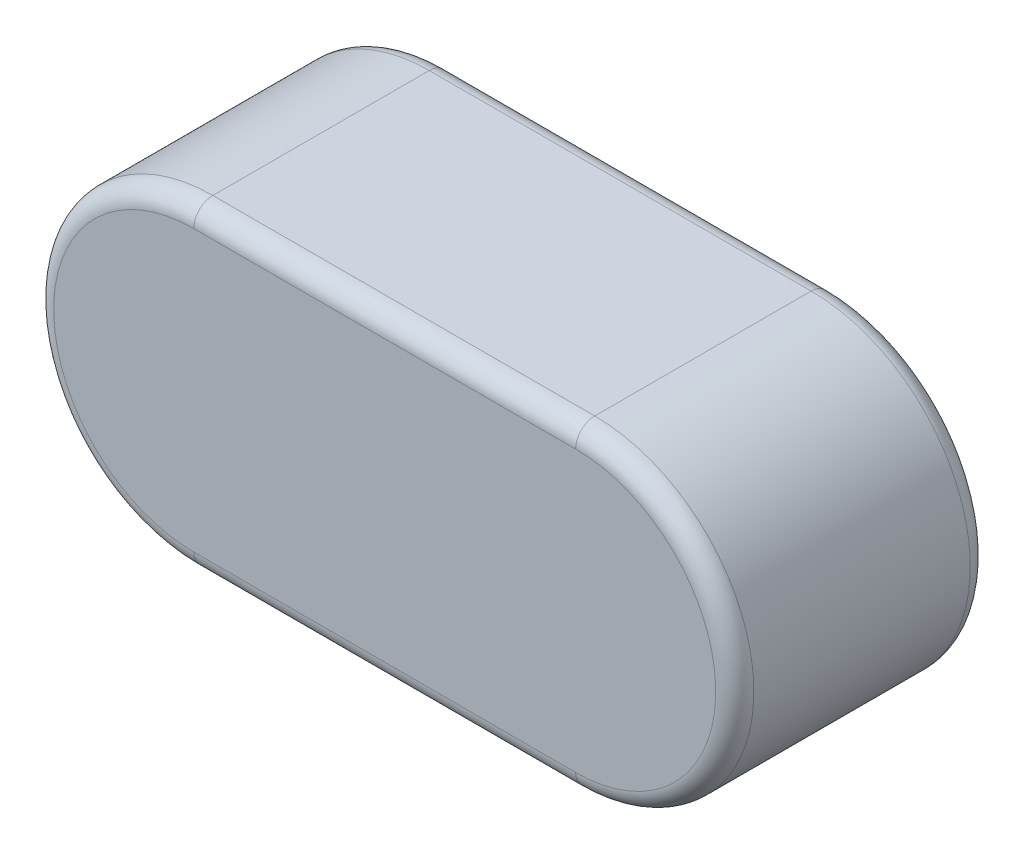
ISO-10303-21;
HEADER;
FILE_DESCRIPTION(('STEP AP214'),'2;1');
FILE_NAME('part.step','',(''),(''),'','','');
FILE_SCHEMA(('AUTOMOTIVE_DESIGN { 1 0 10303 214 1 1 1 1 }'));
ENDSEC;
DATA;
#1=APPLICATION_CONTEXT('core data for automotive mechanical design processes');
#2=APPLICATION_PROTOCOL_DEFINITION('international standard','automotive_design',2000,#1);
#3=PRODUCT_CONTEXT('',#1,'mechanical');
#4=PRODUCT('Part','Part','',(#3));
#5=PRODUCT_RELATED_PRODUCT_CATEGORY('part','',(#4));
#6=PRODUCT_DEFINITION_FORMATION('','',#4);
#7=PRODUCT_DEFINITION_CONTEXT('part definition',#1,'design');
#8=PRODUCT_DEFINITION('design','',#6,#7);
#9=PRODUCT_DEFINITION_SHAPE('','',#8);
#10=(LENGTH_UNIT() NAMED_UNIT(*) SI_UNIT(.MILLI.,.METRE.));
#11=(NAMED_UNIT(*) PLANE_ANGLE_UNIT() SI_UNIT($,.RADIAN.));
#12=(NAMED_UNIT(*) SI_UNIT($,.STERADIAN.) SOLID_ANGLE_UNIT());
#13=UNCERTAINTY_MEASURE_WITH_UNIT(LENGTH_MEASURE(1.E-05),#10,'distance_accuracy_value','');
#14=(GEOMETRIC_REPRESENTATION_CONTEXT(3) GLOBAL_UNCERTAINTY_ASSIGNED_CONTEXT((#13)) GLOBAL_UNIT_ASSIGNED_CONTEXT((#10,
#11,#12)) REPRESENTATION_CONTEXT('',''));
#15=CARTESIAN_POINT('',(0.,0.,0.));
#16=DIRECTION('',(0.,0.,1.));
#17=DIRECTION('',(1.,0.,0.));
#18=AXIS2_PLACEMENT_3D('',#15,#16,#17);
#19=CARTESIAN_POINT('',(-6.,0.,8.));
#20=DIRECTION('',(0.,0.,-1.));
#21=DIRECTION('',(-1.,0.,0.));
#22=AXIS2_PLACEMENT_3D('',#19,#20,#21);
#23=CYLINDRICAL_SURFACE('',#22,5.);
#24=DIRECTION('',(0.,0.,-1.));
#25=VECTOR('',#24,1.);
#26=CARTESIAN_POINT('',(-6.,-5.,8.));
#27=LINE('',#26,#25);
#28=CARTESIAN_POINT('',(-6.,-5.,7.4));
#29=VERTEX_POINT('',#28);
#30=CARTESIAN_POINT('',(-6.,-5.,0.6));
#31=VERTEX_POINT('',#30);
#32=EDGE_CURVE('E128',#29,#31,#27,.T.);
#33=ORIENTED_EDGE('',*,*,#32,.F.);
#34=CARTESIAN_POINT('',(-6.,0.,7.4));
#35=DIRECTION('',(0.,0.,1.));
#36=DIRECTION('',(1.,0.,0.));
#37=AXIS2_PLACEMENT_3D('',#34,#35,#36);
#38=CIRCLE('',#37,5.);
#39=CARTESIAN_POINT('',(-6.,5.,7.4));
#40=VERTEX_POINT('',#39);
#41=EDGE_CURVE('E64',#29,#40,#38,.F.);
#42=ORIENTED_EDGE('',*,*,#41,.T.);
#43=DIRECTION('',(0.,0.,-1.));
#44=VECTOR('',#43,1.);
#45=CARTESIAN_POINT('',(-6.,5.,8.));
#46=LINE('',#45,#44);
#47=CARTESIAN_POINT('',(-6.,5.,0.6));
#48=VERTEX_POINT('',#47);
#49=EDGE_CURVE('E164',#40,#48,#46,.T.);
#50=ORIENTED_EDGE('',*,*,#49,.T.);
#51=CARTESIAN_POINT('',(-6.,0.,0.6));
#52=DIRECTION('',(0.,0.,1.));
#53=DIRECTION('',(1.,0.,0.));
#54=AXIS2_PLACEMENT_3D('',#51,#52,#53);
#55=CIRCLE('',#54,5.);
#56=EDGE_CURVE('E155',#48,#31,#55,.T.);
#57=ORIENTED_EDGE('',*,*,#56,.T.);
#58=EDGE_LOOP('',(#33,#42,#50,#57));
#59=FACE_BOUND('',#58,.T.);
#60=ADVANCED_FACE('F41',(#59),#23,.T.);
#61=CARTESIAN_POINT('',(-6.,-5.,8.));
#62=DIRECTION('',(0.,1.,0.));
#63=DIRECTION('',(-1.,0.,0.));
#64=AXIS2_PLACEMENT_3D('',#61,#62,#63);
#65=PLANE('',#64);
#66=DIRECTION('',(0.,0.,-1.));
#67=VECTOR('',#66,1.);
#68=CARTESIAN_POINT('',(6.,-5.,8.));
#69=LINE('',#68,#67);
#70=CARTESIAN_POINT('',(6.,-5.,7.4));
#71=VERTEX_POINT('',#70);
#72=CARTESIAN_POINT('',(6.,-5.,0.6));
#73=VERTEX_POINT('',#72);
#74=EDGE_CURVE('E197',#71,#73,#69,.T.);
#75=ORIENTED_EDGE('',*,*,#74,.F.);
#76=DIRECTION('',(1.,0.,0.));
#77=VECTOR('',#76,1.);
#78=CARTESIAN_POINT('',(-6.,-5.,7.4));
#79=LINE('',#78,#77);
#80=EDGE_CURVE('E153',#71,#29,#79,.F.);
#81=ORIENTED_EDGE('',*,*,#80,.T.);
#82=ORIENTED_EDGE('',*,*,#32,.T.);
#83=DIRECTION('',(1.,0.,0.));
#84=VECTOR('',#83,1.);
#85=CARTESIAN_POINT('',(-6.,-5.,0.6));
#86=LINE('',#85,#84);
#87=EDGE_CURVE('E151',#31,#73,#86,.T.);
#88=ORIENTED_EDGE('',*,*,#87,.T.);
#89=EDGE_LOOP('',(#75,#81,#82,#88));
#90=FACE_BOUND('',#89,.T.);
#91=ADVANCED_FACE('F211',(#90),#65,.F.);
#92=CARTESIAN_POINT('',(6.,0.,8.));
#93=DIRECTION('',(0.,0.,-1.));
#94=DIRECTION('',(-1.,0.,0.));
#95=AXIS2_PLACEMENT_3D('',#92,#93,#94);
#96=CYLINDRICAL_SURFACE('',#95,5.);
#97=DIRECTION('',(0.,0.,-1.));
#98=VECTOR('',#97,1.);
#99=CARTESIAN_POINT('',(6.,5.,8.));
#100=LINE('',#99,#98);
#101=CARTESIAN_POINT('',(6.,5.,7.4));
#102=VERTEX_POINT('',#101);
#103=CARTESIAN_POINT('',(6.,5.,0.6));
#104=VERTEX_POINT('',#103);
#105=EDGE_CURVE('E195',#102,#104,#100,.T.);
#106=ORIENTED_EDGE('',*,*,#105,.F.);
#107=CARTESIAN_POINT('',(6.,0.,7.4));
#108=DIRECTION('',(0.,0.,1.));
#109=DIRECTION('',(1.,0.,0.));
#110=AXIS2_PLACEMENT_3D('',#107,#108,#109);
#111=CIRCLE('',#110,5.);
#112=EDGE_CURVE('E115',#102,#71,#111,.F.);
#113=ORIENTED_EDGE('',*,*,#112,.T.);
#114=ORIENTED_EDGE('',*,*,#74,.T.);
#115=CARTESIAN_POINT('',(6.,0.,0.6));
#116=DIRECTION('',(0.,0.,1.));
#117=DIRECTION('',(1.,0.,0.));
#118=AXIS2_PLACEMENT_3D('',#115,#116,#117);
#119=CIRCLE('',#118,5.);
#120=EDGE_CURVE('E134',#73,#104,#119,.T.);
#121=ORIENTED_EDGE('',*,*,#120,.T.);
#122=EDGE_LOOP('',(#106,#113,#114,#121));
#123=FACE_BOUND('',#122,.T.);
#124=ADVANCED_FACE('F194',(#123),#96,.T.);
#125=CARTESIAN_POINT('',(-6.,5.,8.));
#126=DIRECTION('',(0.,-1.,0.));
#127=DIRECTION('',(1.,0.,0.));
#128=AXIS2_PLACEMENT_3D('',#125,#126,#127);
#129=PLANE('',#128);
#130=ORIENTED_EDGE('',*,*,#49,.F.);
#131=DIRECTION('',(-1.,0.,0.));
#132=VECTOR('',#131,1.);
#133=CARTESIAN_POINT('',(6.,5.,7.4));
#134=LINE('',#133,#132);
#135=EDGE_CURVE('E11',#40,#102,#134,.F.);
#136=ORIENTED_EDGE('',*,*,#135,.T.);
#137=ORIENTED_EDGE('',*,*,#105,.T.);
#138=DIRECTION('',(-1.,0.,0.));
#139=VECTOR('',#138,1.);
#140=CARTESIAN_POINT('',(-6.,5.,0.6));
#141=LINE('',#140,#139);
#142=EDGE_CURVE('E50',#104,#48,#141,.T.);
#143=ORIENTED_EDGE('',*,*,#142,.T.);
#144=EDGE_LOOP('',(#130,#136,#137,#143));
#145=FACE_BOUND('',#144,.T.);
#146=ADVANCED_FACE('F198',(#145),#129,.F.);
#147=CARTESIAN_POINT('',(-6.,0.,8.));
#148=DIRECTION('',(0.,0.,1.));
#149=DIRECTION('',(1.,0.,0.));
#150=AXIS2_PLACEMENT_3D('',#147,#148,#149);
#151=PLANE('',#150);
#152=DIRECTION('',(1.,0.,0.));
#153=VECTOR('',#152,1.);
#154=CARTESIAN_POINT('',(6.,-4.4,8.));
#155=LINE('',#154,#153);
#156=CARTESIAN_POINT('',(-6.,-4.4,8.));
#157=VERTEX_POINT('',#156);
#158=CARTESIAN_POINT('',(6.,-4.4,8.));
#159=VERTEX_POINT('',#158);
#160=EDGE_CURVE('E132',#157,#159,#155,.T.);
#161=ORIENTED_EDGE('',*,*,#160,.T.);
#162=CARTESIAN_POINT('',(6.,0.,8.));
#163=DIRECTION('',(0.,0.,1.));
#164=DIRECTION('',(1.,0.,0.));
#165=AXIS2_PLACEMENT_3D('',#162,#163,#164);
#166=CIRCLE('',#165,4.4);
#167=CARTESIAN_POINT('',(6.,4.4,8.));
#168=VERTEX_POINT('',#167);
#169=EDGE_CURVE('E113',#159,#168,#166,.T.);
#170=ORIENTED_EDGE('',*,*,#169,.T.);
#171=DIRECTION('',(-1.,0.,0.));
#172=VECTOR('',#171,1.);
#173=CARTESIAN_POINT('',(-6.,4.4,8.));
#174=LINE('',#173,#172);
#175=CARTESIAN_POINT('',(-6.,4.4,8.));
#176=VERTEX_POINT('',#175);
#177=EDGE_CURVE('E121',#168,#176,#174,.T.);
#178=ORIENTED_EDGE('',*,*,#177,.T.);
#179=CARTESIAN_POINT('',(-6.,0.,8.));
#180=DIRECTION('',(0.,0.,1.));
#181=DIRECTION('',(1.,0.,0.));
#182=AXIS2_PLACEMENT_3D('',#179,#180,#181);
#183=CIRCLE('',#182,4.4);
#184=EDGE_CURVE('E127',#176,#157,#183,.T.);
#185=ORIENTED_EDGE('',*,*,#184,.T.);
#186=EDGE_LOOP('',(#161,#170,#178,#185));
#187=FACE_BOUND('',#186,.T.);
#188=ADVANCED_FACE('F130',(#187),#151,.T.);
#189=CARTESIAN_POINT('',(-6.,0.,0.));
#190=DIRECTION('',(0.,0.,1.));
#191=DIRECTION('',(1.,0.,0.));
#192=AXIS2_PLACEMENT_3D('',#189,#190,#191);
#193=PLANE('',#192);
#194=DIRECTION('',(-1.,0.,0.));
#195=VECTOR('',#194,1.);
#196=CARTESIAN_POINT('',(-6.,4.4,0.));
#197=LINE('',#196,#195);
#198=CARTESIAN_POINT('',(-6.,4.4,0.));
#199=VERTEX_POINT('',#198);
#200=CARTESIAN_POINT('',(6.,4.4,0.));
#201=VERTEX_POINT('',#200);
#202=EDGE_CURVE('E146',#199,#201,#197,.F.);
#203=ORIENTED_EDGE('',*,*,#202,.T.);
#204=CARTESIAN_POINT('',(6.,0.,0.));
#205=DIRECTION('',(0.,0.,1.));
#206=DIRECTION('',(1.,0.,0.));
#207=AXIS2_PLACEMENT_3D('',#204,#205,#206);
#208=CIRCLE('',#207,4.4);
#209=CARTESIAN_POINT('',(6.,-4.4,0.));
#210=VERTEX_POINT('',#209);
#211=EDGE_CURVE('E148',#201,#210,#208,.F.);
#212=ORIENTED_EDGE('',*,*,#211,.T.);
#213=DIRECTION('',(1.,0.,0.));
#214=VECTOR('',#213,1.);
#215=CARTESIAN_POINT('',(-6.,-4.4,0.));
#216=LINE('',#215,#214);
#217=CARTESIAN_POINT('',(-6.,-4.4,0.));
#218=VERTEX_POINT('',#217);
#219=EDGE_CURVE('E142',#210,#218,#216,.F.);
#220=ORIENTED_EDGE('',*,*,#219,.T.);
#221=CARTESIAN_POINT('',(-6.,0.,0.));
#222=DIRECTION('',(0.,0.,1.));
#223=DIRECTION('',(1.,0.,0.));
#224=AXIS2_PLACEMENT_3D('',#221,#222,#223);
#225=CIRCLE('',#224,4.4);
#226=EDGE_CURVE('E144',#218,#199,#225,.F.);
#227=ORIENTED_EDGE('',*,*,#226,.T.);
#228=EDGE_LOOP('',(#203,#212,#220,#227));
#229=FACE_BOUND('',#228,.T.);
#230=ADVANCED_FACE('F184',(#229),#193,.F.);
#231=CARTESIAN_POINT('',(-6.,0.,7.4));
#232=DIRECTION('',(0.,0.,1.));
#233=DIRECTION('',(1.,0.,0.));
#234=AXIS2_PLACEMENT_3D('',#231,#232,#233);
#235=TOROIDAL_SURFACE('',#234,4.4,0.6);
#236=CARTESIAN_POINT('',(-6.,4.4,7.4));
#237=DIRECTION('',(1.,0.,0.));
#238=DIRECTION('',(0.,0.,-1.));
#239=AXIS2_PLACEMENT_3D('',#236,#237,#238);
#240=CIRCLE('',#239,0.6);
#241=EDGE_CURVE('E124',#40,#176,#240,.T.);
#242=ORIENTED_EDGE('',*,*,#241,.F.);
#243=ORIENTED_EDGE('',*,*,#41,.F.);
#244=CARTESIAN_POINT('',(-6.,-4.4,7.4));
#245=DIRECTION('',(1.,0.,0.));
#246=DIRECTION('',(0.,0.,-1.));
#247=AXIS2_PLACEMENT_3D('',#244,#245,#246);
#248=CIRCLE('',#247,0.6);
#249=EDGE_CURVE('E161',#157,#29,#248,.T.);
#250=ORIENTED_EDGE('',*,*,#249,.F.);
#251=ORIENTED_EDGE('',*,*,#184,.F.);
#252=EDGE_LOOP('',(#242,#243,#250,#251));
#253=FACE_BOUND('',#252,.T.);
#254=ADVANCED_FACE('F206',(#253),#235,.T.);
#255=CARTESIAN_POINT('',(-6.,-4.4,7.4));
#256=DIRECTION('',(-1.,0.,0.));
#257=DIRECTION('',(0.,-1.,0.));
#258=AXIS2_PLACEMENT_3D('',#255,#256,#257);
#259=CYLINDRICAL_SURFACE('',#258,0.6);
#260=ORIENTED_EDGE('',*,*,#249,.T.);
#261=ORIENTED_EDGE('',*,*,#80,.F.);
#262=CARTESIAN_POINT('',(6.,-4.4,7.4));
#263=DIRECTION('',(1.,0.,0.));
#264=DIRECTION('',(0.,0.,-1.));
#265=AXIS2_PLACEMENT_3D('',#262,#263,#264);
#266=CIRCLE('',#265,0.6);
#267=EDGE_CURVE('E118',#159,#71,#266,.T.);
#268=ORIENTED_EDGE('',*,*,#267,.F.);
#269=ORIENTED_EDGE('',*,*,#160,.F.);
#270=EDGE_LOOP('',(#260,#261,#268,#269));
#271=FACE_BOUND('',#270,.T.);
#272=ADVANCED_FACE('F209',(#271),#259,.T.);
#273=CARTESIAN_POINT('',(-6.,4.4,7.4));
#274=DIRECTION('',(1.,0.,0.));
#275=DIRECTION('',(0.,1.,0.));
#276=AXIS2_PLACEMENT_3D('',#273,#274,#275);
#277=CYLINDRICAL_SURFACE('',#276,0.6);
#278=ORIENTED_EDGE('',*,*,#241,.T.);
#279=ORIENTED_EDGE('',*,*,#177,.F.);
#280=CARTESIAN_POINT('',(6.,4.4,7.4));
#281=DIRECTION('',(1.,0.,0.));
#282=DIRECTION('',(0.,0.,-1.));
#283=AXIS2_PLACEMENT_3D('',#280,#281,#282);
#284=CIRCLE('',#283,0.6);
#285=EDGE_CURVE('E109',#102,#168,#284,.T.);
#286=ORIENTED_EDGE('',*,*,#285,.F.);
#287=ORIENTED_EDGE('',*,*,#135,.F.);
#288=EDGE_LOOP('',(#278,#279,#286,#287));
#289=FACE_BOUND('',#288,.T.);
#290=ADVANCED_FACE('F122',(#289),#277,.T.);
#291=CARTESIAN_POINT('',(6.,0.,7.4));
#292=DIRECTION('',(0.,0.,1.));
#293=DIRECTION('',(1.,0.,0.));
#294=AXIS2_PLACEMENT_3D('',#291,#292,#293);
#295=TOROIDAL_SURFACE('',#294,4.4,0.6);
#296=ORIENTED_EDGE('',*,*,#267,.T.);
#297=ORIENTED_EDGE('',*,*,#112,.F.);
#298=ORIENTED_EDGE('',*,*,#285,.T.);
#299=ORIENTED_EDGE('',*,*,#169,.F.);
#300=EDGE_LOOP('',(#296,#297,#298,#299));
#301=FACE_BOUND('',#300,.T.);
#302=ADVANCED_FACE('F111',(#301),#295,.T.);
#303=CARTESIAN_POINT('',(-6.,0.,0.6));
#304=DIRECTION('',(0.,0.,1.));
#305=DIRECTION('',(1.,0.,0.));
#306=AXIS2_PLACEMENT_3D('',#303,#304,#305);
#307=TOROIDAL_SURFACE('',#306,4.4,0.6);
#308=CARTESIAN_POINT('',(-6.,4.4,0.6));
#309=DIRECTION('',(1.,0.,0.));
#310=DIRECTION('',(0.,0.,-1.));
#311=AXIS2_PLACEMENT_3D('',#308,#309,#310);
#312=CIRCLE('',#311,0.6);
#313=EDGE_CURVE('E168',#199,#48,#312,.T.);
#314=ORIENTED_EDGE('',*,*,#313,.F.);
#315=ORIENTED_EDGE('',*,*,#226,.F.);
#316=CARTESIAN_POINT('',(-6.,-4.4,0.6));
#317=DIRECTION('',(1.,0.,0.));
#318=DIRECTION('',(0.,0.,-1.));
#319=AXIS2_PLACEMENT_3D('',#316,#317,#318);
#320=CIRCLE('',#319,0.6);
#321=EDGE_CURVE('E45',#31,#218,#320,.T.);
#322=ORIENTED_EDGE('',*,*,#321,.F.);
#323=ORIENTED_EDGE('',*,*,#56,.F.);
#324=EDGE_LOOP('',(#314,#315,#322,#323));
#325=FACE_BOUND('',#324,.T.);
#326=ADVANCED_FACE('F43',(#325),#307,.T.);
#327=CARTESIAN_POINT('',(-6.,-4.4,0.6));
#328=DIRECTION('',(1.,0.,0.));
#329=DIRECTION('',(0.,1.,0.));
#330=AXIS2_PLACEMENT_3D('',#327,#328,#329);
#331=CYLINDRICAL_SURFACE('',#330,0.6);
#332=ORIENTED_EDGE('',*,*,#321,.T.);
#333=ORIENTED_EDGE('',*,*,#219,.F.);
#334=CARTESIAN_POINT('',(6.,-4.4,0.6));
#335=DIRECTION('',(1.,0.,0.));
#336=DIRECTION('',(0.,0.,-1.));
#337=AXIS2_PLACEMENT_3D('',#334,#335,#336);
#338=CIRCLE('',#337,0.6);
#339=EDGE_CURVE('E167',#73,#210,#338,.T.);
#340=ORIENTED_EDGE('',*,*,#339,.F.);
#341=ORIENTED_EDGE('',*,*,#87,.F.);
#342=EDGE_LOOP('',(#332,#333,#340,#341));
#343=FACE_BOUND('',#342,.T.);
#344=ADVANCED_FACE('F178',(#343),#331,.T.);
#345=CARTESIAN_POINT('',(-6.,4.4,0.6));
#346=DIRECTION('',(-1.,0.,0.));
#347=DIRECTION('',(0.,-1.,0.));
#348=AXIS2_PLACEMENT_3D('',#345,#346,#347);
#349=CYLINDRICAL_SURFACE('',#348,0.6);
#350=ORIENTED_EDGE('',*,*,#313,.T.);
#351=ORIENTED_EDGE('',*,*,#142,.F.);
#352=CARTESIAN_POINT('',(6.,4.4,0.6));
#353=DIRECTION('',(1.,0.,0.));
#354=DIRECTION('',(0.,0.,-1.));
#355=AXIS2_PLACEMENT_3D('',#352,#353,#354);
#356=CIRCLE('',#355,0.6);
#357=EDGE_CURVE('E165',#201,#104,#356,.T.);
#358=ORIENTED_EDGE('',*,*,#357,.F.);
#359=ORIENTED_EDGE('',*,*,#202,.F.);
#360=EDGE_LOOP('',(#350,#351,#358,#359));
#361=FACE_BOUND('',#360,.T.);
#362=ADVANCED_FACE('F190',(#361),#349,.T.);
#363=CARTESIAN_POINT('',(6.,0.,0.6));
#364=DIRECTION('',(0.,0.,1.));
#365=DIRECTION('',(1.,0.,0.));
#366=AXIS2_PLACEMENT_3D('',#363,#364,#365);
#367=TOROIDAL_SURFACE('',#366,4.4,0.6);
#368=ORIENTED_EDGE('',*,*,#339,.T.);
#369=ORIENTED_EDGE('',*,*,#211,.F.);
#370=ORIENTED_EDGE('',*,*,#357,.T.);
#371=ORIENTED_EDGE('',*,*,#120,.F.);
#372=EDGE_LOOP('',(#368,#369,#370,#371));
#373=FACE_BOUND('',#372,.T.);
#374=ADVANCED_FACE('F188',(#373),#367,.T.);
#375=CLOSED_SHELL('',(#60,#91,#124,#146,#188,#230,#254,#272,#290,#302,#326,#344,#362,#374));
#376=MANIFOLD_SOLID_BREP('B2',#375);
#377=ADVANCED_BREP_SHAPE_REPRESENTATION('',(#18,#376),#14);
#378=SHAPE_DEFINITION_REPRESENTATION(#9,#377);
ENDSEC;
END-ISO-10303-21;
